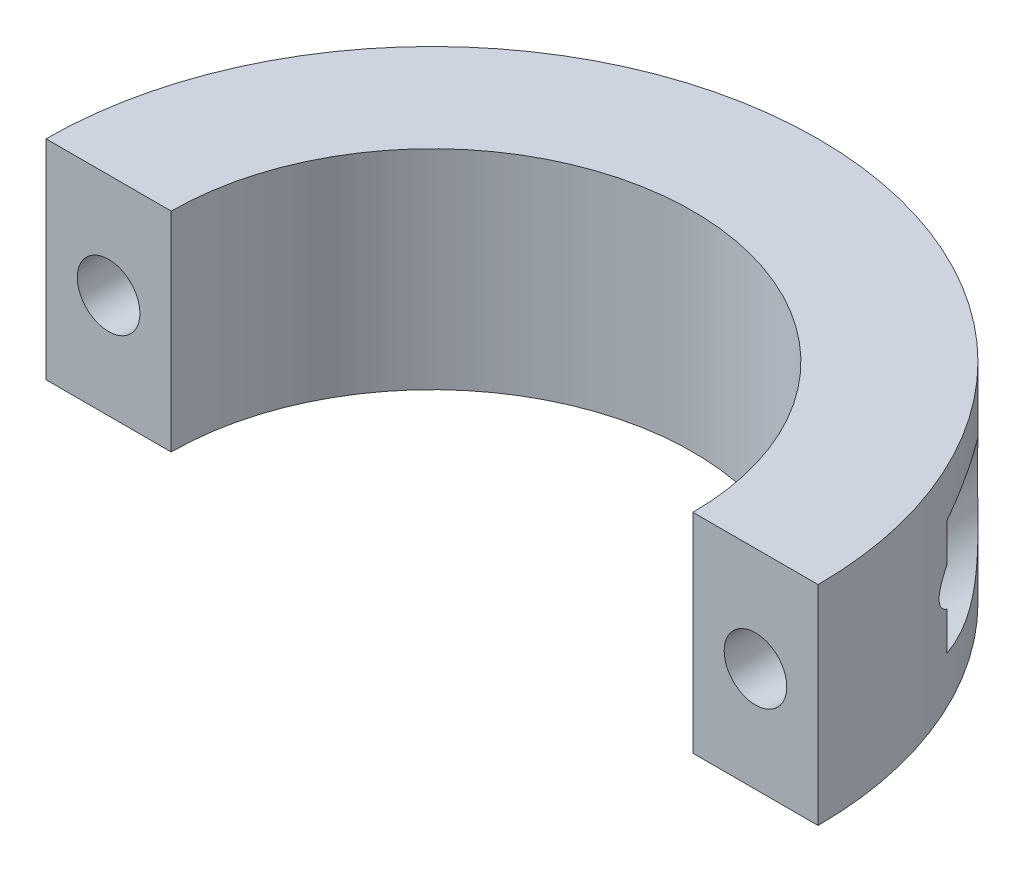
ISO-10303-21;
HEADER;
FILE_DESCRIPTION(('STEP AP214'),'2;1');
FILE_NAME('part.step','',(''),(''),'','','');
FILE_SCHEMA(('AUTOMOTIVE_DESIGN { 1 0 10303 214 1 1 1 1 }'));
ENDSEC;
DATA;
#1=APPLICATION_CONTEXT('core data for automotive mechanical design processes');
#2=APPLICATION_PROTOCOL_DEFINITION('international standard','automotive_design',2000,#1);
#3=PRODUCT_CONTEXT('',#1,'mechanical');
#4=PRODUCT('Part','Part','',(#3));
#5=PRODUCT_RELATED_PRODUCT_CATEGORY('part','',(#4));
#6=PRODUCT_DEFINITION_FORMATION('','',#4);
#7=PRODUCT_DEFINITION_CONTEXT('part definition',#1,'design');
#8=PRODUCT_DEFINITION('design','',#6,#7);
#9=PRODUCT_DEFINITION_SHAPE('','',#8);
#10=(LENGTH_UNIT() NAMED_UNIT(*) SI_UNIT(.MILLI.,.METRE.));
#11=(NAMED_UNIT(*) PLANE_ANGLE_UNIT() SI_UNIT($,.RADIAN.));
#12=(NAMED_UNIT(*) SI_UNIT($,.STERADIAN.) SOLID_ANGLE_UNIT());
#13=UNCERTAINTY_MEASURE_WITH_UNIT(LENGTH_MEASURE(1.E-05),#10,'distance_accuracy_value','');
#14=(GEOMETRIC_REPRESENTATION_CONTEXT(3) GLOBAL_UNCERTAINTY_ASSIGNED_CONTEXT((#13)) GLOBAL_UNIT_ASSIGNED_CONTEXT((#10,
#11,#12)) REPRESENTATION_CONTEXT('',''));
#15=CARTESIAN_POINT('',(0.,0.,0.));
#16=DIRECTION('',(0.,0.,1.));
#17=DIRECTION('',(1.,0.,0.));
#18=AXIS2_PLACEMENT_3D('',#15,#16,#17);
#19=CARTESIAN_POINT('',(0.,10.,0.));
#20=DIRECTION('',(0.,-1.,0.));
#21=DIRECTION('',(0.,0.,-1.));
#22=AXIS2_PLACEMENT_3D('',#19,#20,#21);
#23=CYLINDRICAL_SURFACE('',#22,18.5);
#24=CARTESIAN_POINT('',(0.,0.,0.));
#25=DIRECTION('',(0.,1.,0.));
#26=DIRECTION('',(0.,0.,1.));
#27=AXIS2_PLACEMENT_3D('',#24,#25,#26);
#28=CIRCLE('',#27,18.5);
#29=CARTESIAN_POINT('',(18.5,0.,0.));
#30=VERTEX_POINT('',#29);
#31=CARTESIAN_POINT('',(-18.5,0.,0.));
#32=VERTEX_POINT('',#31);
#33=EDGE_CURVE('E189',#30,#32,#28,.T.);
#34=ORIENTED_EDGE('',*,*,#33,.T.);
#35=DIRECTION('',(0.,-1.,0.));
#36=VECTOR('',#35,1.);
#37=CARTESIAN_POINT('',(-18.5,10.,0.));
#38=LINE('',#37,#36);
#39=CARTESIAN_POINT('',(-18.5,10.,0.));
#40=VERTEX_POINT('',#39);
#41=EDGE_CURVE('E199',#40,#32,#38,.T.);
#42=ORIENTED_EDGE('',*,*,#41,.F.);
#43=CARTESIAN_POINT('',(0.,10.,0.));
#44=DIRECTION('',(0.,1.,0.));
#45=DIRECTION('',(0.,0.,1.));
#46=AXIS2_PLACEMENT_3D('',#43,#44,#45);
#47=CIRCLE('',#46,18.5);
#48=CARTESIAN_POINT('',(18.5,10.,0.));
#49=VERTEX_POINT('',#48);
#50=EDGE_CURVE('E85',#49,#40,#47,.T.);
#51=ORIENTED_EDGE('',*,*,#50,.F.);
#52=DIRECTION('',(0.,-1.,0.));
#53=VECTOR('',#52,1.);
#54=CARTESIAN_POINT('',(18.5,10.,0.));
#55=LINE('',#54,#53);
#56=EDGE_CURVE('E197',#49,#30,#55,.T.);
#57=ORIENTED_EDGE('',*,*,#56,.T.);
#58=EDGE_LOOP('',(#34,#42,#51,#57));
#59=FACE_BOUND('',#58,.T.);
#60=CARTESIAN_POINT('',(-16.6808273176123,2.24216627658943,-8.));
#61=CARTESIAN_POINT('',(-16.6273131054231,2.21925624853974,-8.11158225504267));
#62=CARTESIAN_POINT('',(-16.5725765538614,2.19765930984917,-8.22284207285999));
#63=CARTESIAN_POINT('',(-16.4606496667734,2.15734368945134,-8.4446702027893));
#64=CARTESIAN_POINT('',(-16.403458909106,2.13862550546916,-8.55523839215838));
#65=CARTESIAN_POINT('',(-16.2279239555367,2.087091669519,-8.88633633523037));
#66=CARTESIAN_POINT('',(-16.1058883414374,2.05901551053339,-9.10569312001391));
#67=CARTESIAN_POINT('',(-15.8512215164987,2.01781455816088,-9.54217899481963));
#68=CARTESIAN_POINT('',(-15.7185084640344,2.00481996048955,-9.75927288268145));
#69=CARTESIAN_POINT('',(-15.4441553571179,1.99738540334805,-10.1878668596809));
#70=CARTESIAN_POINT('',(-15.302526443573,2.00292272157953,-10.3993734788249));
#71=CARTESIAN_POINT('',(-15.0788400785296,2.02866879916333,-10.7190129658622));
#72=CARTESIAN_POINT('',(-14.9995135421081,2.04091104050898,-10.8297298715683));
#73=CARTESIAN_POINT('',(-14.838930254364,2.07259703423088,-11.0487360665279));
#74=CARTESIAN_POINT('',(-14.7576734828093,2.09204086212282,-11.1570253303126));
#75=CARTESIAN_POINT('',(-14.5936679406102,2.13891026496183,-11.3707077257658));
#76=CARTESIAN_POINT('',(-14.5109193429459,2.16633492002991,-11.4761011896761));
#77=CARTESIAN_POINT('',(-14.3444960488358,2.23002725635092,-11.6834541291999));
#78=CARTESIAN_POINT('',(-14.2608213754837,2.26629471756322,-11.7854136901893));
#79=CARTESIAN_POINT('',(-14.0919992401886,2.34924212928554,-11.9867878718863));
#80=CARTESIAN_POINT('',(-14.0068492679345,2.39607651582347,-12.086137467272));
#81=CARTESIAN_POINT('',(-13.8374432678538,2.50083516428514,-12.2797274502856));
#82=CARTESIAN_POINT('',(-13.7531874746408,2.55876226431213,-12.3739665224361));
#83=CARTESIAN_POINT('',(-13.587313146564,2.68644389654414,-12.5558755554944));
#84=CARTESIAN_POINT('',(-13.5056862652118,2.75615543462062,-12.6435677824365));
#85=CARTESIAN_POINT('',(-13.3466676932914,2.90829012095286,-12.8113155780865));
#86=CARTESIAN_POINT('',(-13.2692719141923,2.99070069304811,-12.8913785766117));
#87=CARTESIAN_POINT('',(-13.1125556220371,3.17880934642161,-13.0508517421689));
#88=CARTESIAN_POINT('',(-13.0339976665422,3.28608412567272,-13.1291757109014));
#89=CARTESIAN_POINT('',(-12.8886632882856,3.51694414053308,-13.2718782268533));
#90=CARTESIAN_POINT('',(-12.8218832225787,3.64052431207704,-13.3362610875176));
#91=CARTESIAN_POINT('',(-12.7335420205535,3.83725684035735,-13.4204544446403));
#92=CARTESIAN_POINT('',(-12.7059561751229,3.90510493546882,-13.4465566346186));
#93=CARTESIAN_POINT('',(-12.6554212201761,4.04405739871183,-13.4941288915382));
#94=CARTESIAN_POINT('',(-12.6324697033015,4.11516005255315,-13.5156013638379));
#95=CARTESIAN_POINT('',(-12.5917050923089,4.2600805151752,-13.5535878718061));
#96=CARTESIAN_POINT('',(-12.5738894143916,4.33389693753054,-13.5701044009415));
#97=CARTESIAN_POINT('',(-12.5437943681128,4.48358206329639,-13.5979275743063));
#98=CARTESIAN_POINT('',(-12.531514081712,4.5594504241809,-13.6092350824536));
#99=CARTESIAN_POINT('',(-12.5059464407527,4.76878607802364,-13.6327492693608));
#100=CARTESIAN_POINT('',(-12.4985288639878,4.9036789168311,-13.6395305120175));
#101=CARTESIAN_POINT('',(-12.5019602332136,5.17292990100803,-13.6363845946899));
#102=CARTESIAN_POINT('',(-12.5128028405035,5.30728821570064,-13.6264632327205));
#103=CARTESIAN_POINT('',(-12.5504412770419,5.56163074968477,-13.5917990630945));
#104=CARTESIAN_POINT('',(-12.5760282952034,5.68195225596617,-13.5681785162082));
#105=CARTESIAN_POINT('',(-12.640547050979,5.91554556130104,-13.5080902047127));
#106=CARTESIAN_POINT('',(-12.6794796397169,6.02881691018086,-13.4716216207061));
#107=CARTESIAN_POINT('',(-12.771423973953,6.25319672639045,-13.3845046301893));
#108=CARTESIAN_POINT('',(-12.8251769482911,6.36370348605095,-13.3330984765542));
#109=CARTESIAN_POINT('',(-12.9426316084479,6.57299069897161,-13.2191150320653));
#110=CARTESIAN_POINT('',(-13.0063391851983,6.67176414737953,-13.1565311232859));
#111=CARTESIAN_POINT('',(-13.1742283823113,6.90262093633876,-12.9888312935535));
#112=CARTESIAN_POINT('',(-13.2829189444111,7.0272322524094,-12.8779243398225));
#113=CARTESIAN_POINT('',(-13.5094505600996,7.25013213026865,-12.6400876642241));
#114=CARTESIAN_POINT('',(-13.6273108481733,7.34836332613991,-12.5131238926482));
#115=CARTESIAN_POINT('',(-13.8337232847752,7.49698323766707,-12.2839317094177));
#116=CARTESIAN_POINT('',(-13.921402491358,7.55309648277254,-12.1845274570241));
#117=CARTESIAN_POINT('',(-14.0973628097534,7.65384500669754,-11.980504944953));
#118=CARTESIAN_POINT('',(-14.1856441766033,7.69847506638472,-11.8758843401295));
#119=CARTESIAN_POINT('',(-14.361779264616,7.77736900018666,-11.6622679859082));
#120=CARTESIAN_POINT('',(-14.4496323077324,7.81161975725163,-11.5532668958877));
#121=CARTESIAN_POINT('',(-14.6240296059947,7.87074080650371,-11.3317103368167));
#122=CARTESIAN_POINT('',(-14.7105734089107,7.89560792539827,-11.2191536792896));
#123=CARTESIAN_POINT('',(-14.9331542760877,7.94933320522793,-10.922587063492));
#124=CARTESIAN_POINT('',(-15.06770449372,7.97162097693509,-10.7362571616158));
#125=CARTESIAN_POINT('',(-15.330332206666,7.99810600139789,-10.3578027816951));
#126=CARTESIAN_POINT('',(-15.4584052481586,8.0022909691027,-10.1656744576956));
#127=CARTESIAN_POINT('',(-15.7072531152755,7.99542170445775,-9.7767862440493));
#128=CARTESIAN_POINT('',(-15.8280201296745,7.98435145243438,-9.58002169922591));
#129=CARTESIAN_POINT('',(-16.0615715861235,7.94933429785667,-9.18307879613023));
#130=CARTESIAN_POINT('',(-16.1743592191563,7.92539257596452,-8.98290184269074));
#131=CARTESIAN_POINT('',(-16.3528573226083,7.8771271717181,-8.65191844135857));
#132=CARTESIAN_POINT('',(-16.4209720824553,7.85600558566275,-8.52191969968121));
#133=CARTESIAN_POINT('',(-16.5535543157906,7.80979053259217,-8.26142350461591));
#134=CARTESIAN_POINT('',(-16.6180349483723,7.7847128382875,-8.13092995927584));
#135=CARTESIAN_POINT('',(-16.6808273176123,7.75783372341057,-8.));
#136=B_SPLINE_CURVE_WITH_KNOTS('',3,(#60,#61,#62,#63,#64,#65,#66,#67,#68,#69,#70,#71,#72,#73,
#74,#75,#76,#77,#78,#79,#80,#81,#82,#83,#84,#85,#86,#87,#88,#89,#90,#91,#92,#93,#94,#95,#96,#97,
#98,#99,#100,#101,#102,#103,#104,#105,#106,#107,#108,#109,#110,#111,#112,#113,#114,#115,#116,
#117,#118,#119,#120,#121,#122,#123,#124,#125,#126,#127,#128,#129,#130,#131,#132,#133,#134,#135),
.UNSPECIFIED.,.F.,.F.,(4,2,2,2,2,2,2,2,2,2,2,2,2,2,2,2,2,2,2,2,2,2,2,2,2,2,2,2,2,2,2,2,2,2,2,2,
2,4),(0.,0.37753515629701,0.755135513694899,1.512250142556,2.27585326643714,3.03852046667838,
3.44858858644865,3.85866100630569,4.2686861794682,4.6787011507798,5.09514891450285,
5.51170337030995,5.92676964048657,6.34142747132127,6.80272225432187,7.26387410594381,
7.49684688697526,7.72969833433968,7.96243243075055,8.19512791422785,8.59852461887044,
9.00178132032628,9.37591212277148,9.75006679013187,10.1481521673188,10.5464740218395,
11.1404643139997,11.7357360193284,12.166981823343,12.598423284645,13.0304077364018,
13.4625381429724,14.1541615340059,14.8462542057573,15.5390742057056,16.2316155597639,
16.6763501377223,17.1193544315548),.UNSPECIFIED.);
#137=CARTESIAN_POINT('',(-16.6808273176123,2.24216627658943,-8.));
#138=VERTEX_POINT('',#137);
#139=CARTESIAN_POINT('',(-16.6808273176123,7.75783372341057,-8.));
#140=VERTEX_POINT('',#139);
#141=EDGE_CURVE('E193',#138,#140,#136,.T.);
#142=ORIENTED_EDGE('',*,*,#141,.T.);
#143=DIRECTION('',(0.,-1.,0.));
#144=VECTOR('',#143,1.);
#145=CARTESIAN_POINT('',(-16.6808273176123,10.,-8.));
#146=LINE('',#145,#144);
#147=CARTESIAN_POINT('',(-16.6808273176123,5.92501180856279,-8.));
#148=VERTEX_POINT('',#147);
#149=EDGE_CURVE('E139',#140,#148,#146,.T.);
#150=ORIENTED_EDGE('',*,*,#149,.T.);
#151=CARTESIAN_POINT('',(-16.6808273176123,5.92501180856279,-8.));
#152=CARTESIAN_POINT('',(-16.7008671363795,5.89939894681842,-7.95822019085314));
#153=CARTESIAN_POINT('',(-16.720494112819,5.8726578692459,-7.91688807306192));
#154=CARTESIAN_POINT('',(-16.7588404323034,5.81639523655956,-7.83538662779554));
#155=CARTESIAN_POINT('',(-16.7775548760291,5.78686074343342,-7.79522396283188));
#156=CARTESIAN_POINT('',(-16.8141351185909,5.72414664206879,-7.71600951827897));
#157=CARTESIAN_POINT('',(-16.831978397616,5.69090902464334,-7.67699273545517));
#158=CARTESIAN_POINT('',(-16.8660813234932,5.62075927847746,-7.60177590157281));
#159=CARTESIAN_POINT('',(-16.882344301469,5.58385522586027,-7.56556995943572));
#160=CARTESIAN_POINT('',(-16.9100280567259,5.51282909137866,-7.50345842040993));
#161=CARTESIAN_POINT('',(-16.9217901256394,5.47943571930165,-7.47688089320201));
#162=CARTESIAN_POINT('',(-16.9435008198704,5.4094443655528,-7.42755029971113));
#163=CARTESIAN_POINT('',(-16.9534532318428,5.37285331828388,-7.40478925550685));
#164=CARTESIAN_POINT('',(-16.9711081304078,5.2956832276547,-7.3642369997729));
#165=CARTESIAN_POINT('',(-16.9787744476922,5.25505239215455,-7.34652585873552));
#166=CARTESIAN_POINT('',(-16.9908402820327,5.17084481659007,-7.31857813240109));
#167=CARTESIAN_POINT('',(-16.9952485234202,5.12727628728029,-7.30832158675243));
#168=CARTESIAN_POINT('',(-16.9998983298595,5.04336106571754,-7.29749884422195));
#169=CARTESIAN_POINT('',(-17.0005283312507,5.00315557636883,-7.29602931768692));
#170=CARTESIAN_POINT('',(-16.9985686762657,4.92324318881803,-7.30059367093314));
#171=CARTESIAN_POINT('',(-16.995976872241,4.88353664103863,-7.30663255580595));
#172=CARTESIAN_POINT('',(-16.9877423567979,4.80433656132057,-7.32575710132319));
#173=CARTESIAN_POINT('',(-16.9819673785268,4.76493332272838,-7.33914815611633));
#174=CARTESIAN_POINT('',(-16.9679203078601,4.68902395488642,-7.37156651364212));
#175=CARTESIAN_POINT('',(-16.9596445908914,4.65252212859586,-7.39060199665994));
#176=CARTESIAN_POINT('',(-16.9356872466417,4.56164848294266,-7.44538984156874));
#177=CARTESIAN_POINT('',(-16.9185341610922,4.50962128611862,-7.48433696082816));
#178=CARTESIAN_POINT('',(-16.881001371215,4.41213898500713,-7.56861617360726));
#179=CARTESIAN_POINT('',(-16.8606043425169,4.36672182890503,-7.6139823962218));
#180=CARTESIAN_POINT('',(-16.8148684550805,4.27611942033153,-7.71450652624005));
#181=CARTESIAN_POINT('',(-16.789230484014,4.23166586063975,-7.77018046097729));
#182=CARTESIAN_POINT('',(-16.7493930713285,4.16957546840608,-7.85549518850586));
#183=CARTESIAN_POINT('',(-16.7359974775835,4.14978557186666,-7.88399675735109));
#184=CARTESIAN_POINT('',(-16.7087479345267,4.1114735393401,-7.94158393738102));
#185=CARTESIAN_POINT('',(-16.6948944159331,4.09295025964579,-7.97066899016277));
#186=CARTESIAN_POINT('',(-16.6808273176123,4.07498819143721,-8.));
#187=B_SPLINE_CURVE_WITH_KNOTS('',3,(#151,#152,#153,#154,#155,#156,#157,#158,#159,#160,#161,
#162,#163,#164,#165,#166,#167,#168,#169,#170,#171,#172,#173,#174,#175,#176,#177,#178,#179,#180,
#181,#182,#183,#184,#185,#186),.UNSPECIFIED.,.F.,.F.,(4,2,2,2,2,2,2,2,2,2,2,2,2,2,2,2,2,4),(0.,
0.158873795982409,0.318523281045564,0.481169120019656,0.643464321096317,0.776030303303831,
0.908315620122257,1.04259461627888,1.17651273027173,1.29638860370451,1.41634442900648,
1.54170782154132,1.66725379460788,1.8677674526792,2.06939032930093,2.296095041544,
2.40765884931722,2.51912055130842),.UNSPECIFIED.);
#188=CARTESIAN_POINT('',(-16.6808273176123,4.07498819143721,-8.));
#189=VERTEX_POINT('',#188);
#190=EDGE_CURVE('E142',#148,#189,#187,.T.);
#191=ORIENTED_EDGE('',*,*,#190,.T.);
#192=EDGE_CURVE('E136',#189,#138,#146,.T.);
#193=ORIENTED_EDGE('',*,*,#192,.T.);
#194=EDGE_LOOP('',(#142,#150,#191,#193));
#195=FACE_BOUND('',#194,.T.);
#196=CARTESIAN_POINT('',(16.6808273176123,2.24216627658943,-8.));
#197=CARTESIAN_POINT('',(16.6273131054231,2.21925624853974,-8.11158225504267));
#198=CARTESIAN_POINT('',(16.5725765538614,2.19765930984917,-8.22284207285999));
#199=CARTESIAN_POINT('',(16.4606496667734,2.15734368945134,-8.4446702027893));
#200=CARTESIAN_POINT('',(16.403458909106,2.13862550546916,-8.55523839215838));
#201=CARTESIAN_POINT('',(16.2279239555367,2.087091669519,-8.88633633523037));
#202=CARTESIAN_POINT('',(16.1058883414374,2.05901551053339,-9.10569312001391));
#203=CARTESIAN_POINT('',(15.8512215164987,2.01781455816088,-9.54217899481963));
#204=CARTESIAN_POINT('',(15.7185084640344,2.00481996048955,-9.75927288268145));
#205=CARTESIAN_POINT('',(15.4441553571179,1.99738540334805,-10.1878668596809));
#206=CARTESIAN_POINT('',(15.302526443573,2.00292272157953,-10.3993734788249));
#207=CARTESIAN_POINT('',(15.0788400785296,2.02866879916333,-10.7190129658622));
#208=CARTESIAN_POINT('',(14.9995135421081,2.04091104050898,-10.8297298715683));
#209=CARTESIAN_POINT('',(14.838930254364,2.07259703423088,-11.0487360665279));
#210=CARTESIAN_POINT('',(14.7576734828093,2.09204086212282,-11.1570253303126));
#211=CARTESIAN_POINT('',(14.5936679406102,2.13891026496183,-11.3707077257658));
#212=CARTESIAN_POINT('',(14.5109193429459,2.16633492002991,-11.4761011896761));
#213=CARTESIAN_POINT('',(14.3444960488358,2.23002725635092,-11.6834541291999));
#214=CARTESIAN_POINT('',(14.2608213754837,2.26629471756322,-11.7854136901893));
#215=CARTESIAN_POINT('',(14.0919992401886,2.34924212928554,-11.9867878718863));
#216=CARTESIAN_POINT('',(14.0068492679345,2.39607651582347,-12.086137467272));
#217=CARTESIAN_POINT('',(13.8374432678538,2.50083516428514,-12.2797274502856));
#218=CARTESIAN_POINT('',(13.7531874746408,2.55876226431213,-12.3739665224361));
#219=CARTESIAN_POINT('',(13.587313146564,2.68644389654414,-12.5558755554944));
#220=CARTESIAN_POINT('',(13.5056862652118,2.75615543462062,-12.6435677824365));
#221=CARTESIAN_POINT('',(13.3466676932914,2.90829012095286,-12.8113155780865));
#222=CARTESIAN_POINT('',(13.2692719141923,2.99070069304811,-12.8913785766117));
#223=CARTESIAN_POINT('',(13.1125556220371,3.17880934642161,-13.0508517421689));
#224=CARTESIAN_POINT('',(13.0339976665422,3.28608412567272,-13.1291757109014));
#225=CARTESIAN_POINT('',(12.8886632882856,3.51694414053308,-13.2718782268533));
#226=CARTESIAN_POINT('',(12.8218832225787,3.64052431207704,-13.3362610875176));
#227=CARTESIAN_POINT('',(12.7335420205535,3.83725684035735,-13.4204544446403));
#228=CARTESIAN_POINT('',(12.7059561751229,3.90510493546882,-13.4465566346186));
#229=CARTESIAN_POINT('',(12.6554212201761,4.04405739871183,-13.4941288915382));
#230=CARTESIAN_POINT('',(12.6324697033015,4.11516005255315,-13.5156013638379));
#231=CARTESIAN_POINT('',(12.5917050923089,4.2600805151752,-13.5535878718061));
#232=CARTESIAN_POINT('',(12.5738894143916,4.33389693753054,-13.5701044009415));
#233=CARTESIAN_POINT('',(12.5437943681128,4.48358206329639,-13.5979275743063));
#234=CARTESIAN_POINT('',(12.531514081712,4.5594504241809,-13.6092350824536));
#235=CARTESIAN_POINT('',(12.5059464407527,4.76878607802364,-13.6327492693608));
#236=CARTESIAN_POINT('',(12.4985288639878,4.9036789168311,-13.6395305120175));
#237=CARTESIAN_POINT('',(12.5019602332136,5.17292990100803,-13.6363845946899));
#238=CARTESIAN_POINT('',(12.5128028405035,5.30728821570064,-13.6264632327205));
#239=CARTESIAN_POINT('',(12.5504412770419,5.56163074968477,-13.5917990630945));
#240=CARTESIAN_POINT('',(12.5760282952034,5.68195225596617,-13.5681785162082));
#241=CARTESIAN_POINT('',(12.640547050979,5.91554556130104,-13.5080902047127));
#242=CARTESIAN_POINT('',(12.6794796397169,6.02881691018086,-13.4716216207061));
#243=CARTESIAN_POINT('',(12.771423973953,6.25319672639045,-13.3845046301893));
#244=CARTESIAN_POINT('',(12.8251769482911,6.36370348605095,-13.3330984765542));
#245=CARTESIAN_POINT('',(12.9426316084479,6.57299069897161,-13.2191150320653));
#246=CARTESIAN_POINT('',(13.0063391851983,6.67176414737953,-13.1565311232859));
#247=CARTESIAN_POINT('',(13.1742283823113,6.90262093633876,-12.9888312935535));
#248=CARTESIAN_POINT('',(13.2829189444111,7.0272322524094,-12.8779243398225));
#249=CARTESIAN_POINT('',(13.5094505600996,7.25013213026865,-12.6400876642241));
#250=CARTESIAN_POINT('',(13.6273108481733,7.34836332613991,-12.5131238926482));
#251=CARTESIAN_POINT('',(13.8337232847752,7.49698323766707,-12.2839317094177));
#252=CARTESIAN_POINT('',(13.921402491358,7.55309648277254,-12.1845274570241));
#253=CARTESIAN_POINT('',(14.0973628097534,7.65384500669754,-11.980504944953));
#254=CARTESIAN_POINT('',(14.1856441766033,7.69847506638472,-11.8758843401295));
#255=CARTESIAN_POINT('',(14.361779264616,7.77736900018666,-11.6622679859082));
#256=CARTESIAN_POINT('',(14.4496323077324,7.81161975725163,-11.5532668958877));
#257=CARTESIAN_POINT('',(14.6240296059947,7.87074080650371,-11.3317103368167));
#258=CARTESIAN_POINT('',(14.7105734089107,7.89560792539827,-11.2191536792896));
#259=CARTESIAN_POINT('',(14.9331542760877,7.94933320522793,-10.922587063492));
#260=CARTESIAN_POINT('',(15.06770449372,7.97162097693509,-10.7362571616158));
#261=CARTESIAN_POINT('',(15.330332206666,7.99810600139789,-10.3578027816951));
#262=CARTESIAN_POINT('',(15.4584052481586,8.0022909691027,-10.1656744576956));
#263=CARTESIAN_POINT('',(15.7072531152755,7.99542170445775,-9.7767862440493));
#264=CARTESIAN_POINT('',(15.8280201296745,7.98435145243438,-9.58002169922591));
#265=CARTESIAN_POINT('',(16.0615715861235,7.94933429785667,-9.18307879613023));
#266=CARTESIAN_POINT('',(16.1743592191563,7.92539257596452,-8.98290184269074));
#267=CARTESIAN_POINT('',(16.3528573226083,7.8771271717181,-8.65191844135857));
#268=CARTESIAN_POINT('',(16.4209720824553,7.85600558566275,-8.52191969968121));
#269=CARTESIAN_POINT('',(16.5535543157906,7.80979053259217,-8.26142350461591));
#270=CARTESIAN_POINT('',(16.6180349483723,7.7847128382875,-8.13092995927584));
#271=CARTESIAN_POINT('',(16.6808273176123,7.75783372341057,-8.));
#272=B_SPLINE_CURVE_WITH_KNOTS('',3,(#196,#197,#198,#199,#200,#201,#202,#203,#204,#205,#206,
#207,#208,#209,#210,#211,#212,#213,#214,#215,#216,#217,#218,#219,#220,#221,#222,#223,#224,#225,
#226,#227,#228,#229,#230,#231,#232,#233,#234,#235,#236,#237,#238,#239,#240,#241,#242,#243,#244,
#245,#246,#247,#248,#249,#250,#251,#252,#253,#254,#255,#256,#257,#258,#259,#260,#261,#262,#263,
#264,#265,#266,#267,#268,#269,#270,#271),.UNSPECIFIED.,.F.,.F.,(4,2,2,2,2,2,2,2,2,2,2,2,2,2,2,2,
2,2,2,2,2,2,2,2,2,2,2,2,2,2,2,2,2,2,2,2,2,4),(0.,0.37753515629701,0.755135513694899,
1.512250142556,2.27585326643714,3.03852046667838,3.44858858644865,3.85866100630569,
4.2686861794682,4.6787011507798,5.09514891450285,5.51170337030995,5.92676964048657,
6.34142747132127,6.80272225432187,7.26387410594381,7.49684688697526,7.72969833433968,
7.96243243075055,8.19512791422785,8.59852461887044,9.00178132032628,9.37591212277148,
9.75006679013187,10.1481521673188,10.5464740218395,11.1404643139997,11.7357360193284,
12.166981823343,12.598423284645,13.0304077364018,13.4625381429724,14.1541615340059,
14.8462542057573,15.5390742057056,16.2316155597639,16.6763501377223,17.1193544315548),.UNSPECIFIED.);
#273=CARTESIAN_POINT('',(16.6808273176123,2.24216627658943,-8.));
#274=VERTEX_POINT('',#273);
#275=CARTESIAN_POINT('',(16.6808273176123,7.75783372341057,-8.));
#276=VERTEX_POINT('',#275);
#277=EDGE_CURVE('E11',#274,#276,#272,.T.);
#278=ORIENTED_EDGE('',*,*,#277,.F.);
#279=DIRECTION('',(0.,-1.,0.));
#280=VECTOR('',#279,1.);
#281=CARTESIAN_POINT('',(16.6808273176123,10.,-8.));
#282=LINE('',#281,#280);
#283=CARTESIAN_POINT('',(16.6808273176123,4.07498819143721,-8.));
#284=VERTEX_POINT('',#283);
#285=EDGE_CURVE('E122',#274,#284,#282,.F.);
#286=ORIENTED_EDGE('',*,*,#285,.T.);
#287=CARTESIAN_POINT('',(16.6808273176123,5.92501180856279,-8.));
#288=CARTESIAN_POINT('',(16.7008671363795,5.89939894681842,-7.95822019085314));
#289=CARTESIAN_POINT('',(16.720494112819,5.8726578692459,-7.91688807306192));
#290=CARTESIAN_POINT('',(16.7588404323034,5.81639523655956,-7.83538662779554));
#291=CARTESIAN_POINT('',(16.7775548760291,5.78686074343342,-7.79522396283188));
#292=CARTESIAN_POINT('',(16.8141351185909,5.72414664206879,-7.71600951827897));
#293=CARTESIAN_POINT('',(16.831978397616,5.69090902464334,-7.67699273545517));
#294=CARTESIAN_POINT('',(16.8660813234932,5.62075927847746,-7.60177590157281));
#295=CARTESIAN_POINT('',(16.882344301469,5.58385522586027,-7.56556995943572));
#296=CARTESIAN_POINT('',(16.9100280567259,5.51282909137866,-7.50345842040993));
#297=CARTESIAN_POINT('',(16.9217901256394,5.47943571930165,-7.47688089320201));
#298=CARTESIAN_POINT('',(16.9435008198704,5.4094443655528,-7.42755029971113));
#299=CARTESIAN_POINT('',(16.9534532318428,5.37285331828388,-7.40478925550685));
#300=CARTESIAN_POINT('',(16.9711081304078,5.2956832276547,-7.3642369997729));
#301=CARTESIAN_POINT('',(16.9787744476922,5.25505239215455,-7.34652585873552));
#302=CARTESIAN_POINT('',(16.9908402820327,5.17084481659007,-7.31857813240109));
#303=CARTESIAN_POINT('',(16.9952485234202,5.12727628728029,-7.30832158675243));
#304=CARTESIAN_POINT('',(16.9998983298595,5.04336106571754,-7.29749884422195));
#305=CARTESIAN_POINT('',(17.0005283312507,5.00315557636883,-7.29602931768692));
#306=CARTESIAN_POINT('',(16.9985686762657,4.92324318881803,-7.30059367093314));
#307=CARTESIAN_POINT('',(16.995976872241,4.88353664103863,-7.30663255580595));
#308=CARTESIAN_POINT('',(16.9877423567979,4.80433656132057,-7.32575710132319));
#309=CARTESIAN_POINT('',(16.9819673785268,4.76493332272838,-7.33914815611633));
#310=CARTESIAN_POINT('',(16.9679203078601,4.68902395488642,-7.37156651364212));
#311=CARTESIAN_POINT('',(16.9596445908914,4.65252212859586,-7.39060199665994));
#312=CARTESIAN_POINT('',(16.9356872466417,4.56164848294266,-7.44538984156874));
#313=CARTESIAN_POINT('',(16.9185341610922,4.50962128611862,-7.48433696082816));
#314=CARTESIAN_POINT('',(16.881001371215,4.41213898500713,-7.56861617360726));
#315=CARTESIAN_POINT('',(16.8606043425169,4.36672182890503,-7.6139823962218));
#316=CARTESIAN_POINT('',(16.8148684550805,4.27611942033153,-7.71450652624005));
#317=CARTESIAN_POINT('',(16.789230484014,4.23166586063975,-7.77018046097729));
#318=CARTESIAN_POINT('',(16.7493930713285,4.16957546840608,-7.85549518850586));
#319=CARTESIAN_POINT('',(16.7359974775835,4.14978557186666,-7.88399675735109));
#320=CARTESIAN_POINT('',(16.7087479345267,4.1114735393401,-7.94158393738102));
#321=CARTESIAN_POINT('',(16.6948944159331,4.09295025964579,-7.97066899016277));
#322=CARTESIAN_POINT('',(16.6808273176123,4.07498819143721,-8.));
#323=B_SPLINE_CURVE_WITH_KNOTS('',3,(#287,#288,#289,#290,#291,#292,#293,#294,#295,#296,#297,
#298,#299,#300,#301,#302,#303,#304,#305,#306,#307,#308,#309,#310,#311,#312,#313,#314,#315,#316,
#317,#318,#319,#320,#321,#322),.UNSPECIFIED.,.F.,.F.,(4,2,2,2,2,2,2,2,2,2,2,2,2,2,2,2,2,4),(0.,
0.158873795982409,0.318523281045564,0.481169120019656,0.643464321096317,0.776030303303831,
0.908315620122257,1.04259461627888,1.17651273027173,1.29638860370451,1.41634442900648,
1.54170782154132,1.66725379460788,1.8677674526792,2.06939032930093,2.296095041544,
2.40765884931722,2.51912055130842),.UNSPECIFIED.);
#324=CARTESIAN_POINT('',(16.6808273176123,5.92501180856279,-8.));
#325=VERTEX_POINT('',#324);
#326=EDGE_CURVE('E49',#325,#284,#323,.T.);
#327=ORIENTED_EDGE('',*,*,#326,.F.);
#328=EDGE_CURVE('E120',#325,#276,#282,.F.);
#329=ORIENTED_EDGE('',*,*,#328,.T.);
#330=EDGE_LOOP('',(#278,#286,#327,#329));
#331=FACE_BOUND('',#330,.T.);
#332=ADVANCED_FACE('F35',(#59,#195,#331),#23,.T.);
#333=CARTESIAN_POINT('',(0.,10.,0.));
#334=DIRECTION('',(0.,0.,-1.));
#335=DIRECTION('',(-1.,0.,0.));
#336=AXIS2_PLACEMENT_3D('',#333,#334,#335);
#337=PLANE('',#336);
#338=CARTESIAN_POINT('',(15.5,5.,0.));
#339=DIRECTION('',(0.,0.,-1.));
#340=DIRECTION('',(-1.,0.,0.));
#341=AXIS2_PLACEMENT_3D('',#338,#339,#340);
#342=CIRCLE('',#341,1.5);
#343=CARTESIAN_POINT('',(14.,5.,0.));
#344=VERTEX_POINT('',#343);
#345=EDGE_CURVE('E127',#344,#344,#342,.T.);
#346=ORIENTED_EDGE('',*,*,#345,.T.);
#347=EDGE_LOOP('',(#346));
#348=FACE_BOUND('',#347,.T.);
#349=DIRECTION('',(1.,0.,0.));
#350=VECTOR('',#349,1.);
#351=CARTESIAN_POINT('',(0.,0.,0.));
#352=LINE('',#351,#350);
#353=CARTESIAN_POINT('',(12.5,0.,0.));
#354=VERTEX_POINT('',#353);
#355=EDGE_CURVE('E153',#354,#30,#352,.T.);
#356=ORIENTED_EDGE('',*,*,#355,.T.);
#357=ORIENTED_EDGE('',*,*,#56,.F.);
#358=DIRECTION('',(1.,0.,0.));
#359=VECTOR('',#358,1.);
#360=CARTESIAN_POINT('',(0.,10.,0.));
#361=LINE('',#360,#359);
#362=CARTESIAN_POINT('',(12.5,10.,0.));
#363=VERTEX_POINT('',#362);
#364=EDGE_CURVE('E154',#363,#49,#361,.T.);
#365=ORIENTED_EDGE('',*,*,#364,.F.);
#366=DIRECTION('',(0.,-1.,0.));
#367=VECTOR('',#366,1.);
#368=CARTESIAN_POINT('',(12.5,10.,0.));
#369=LINE('',#368,#367);
#370=EDGE_CURVE('E57',#363,#354,#369,.T.);
#371=ORIENTED_EDGE('',*,*,#370,.T.);
#372=EDGE_LOOP('',(#356,#357,#365,#371));
#373=FACE_BOUND('',#372,.T.);
#374=ADVANCED_FACE('F177',(#348,#373),#337,.F.);
#375=CARTESIAN_POINT('',(-15.5,5.,0.));
#376=DIRECTION('',(0.,0.,1.));
#377=DIRECTION('',(1.,0.,0.));
#378=AXIS2_PLACEMENT_3D('',#375,#376,#377);
#379=CIRCLE('',#378,1.5);
#380=CARTESIAN_POINT('',(-14.,5.,0.));
#381=VERTEX_POINT('',#380);
#382=EDGE_CURVE('E143',#381,#381,#379,.T.);
#383=ORIENTED_EDGE('',*,*,#382,.F.);
#384=EDGE_LOOP('',(#383));
#385=FACE_BOUND('',#384,.T.);
#386=CARTESIAN_POINT('',(-12.5,0.,0.));
#387=VERTEX_POINT('',#386);
#388=EDGE_CURVE('E298',#32,#387,#352,.T.);
#389=ORIENTED_EDGE('',*,*,#388,.T.);
#390=DIRECTION('',(0.,-1.,0.));
#391=VECTOR('',#390,1.);
#392=CARTESIAN_POINT('',(-12.5,10.,0.));
#393=LINE('',#392,#391);
#394=CARTESIAN_POINT('',(-12.5,10.,0.));
#395=VERTEX_POINT('',#394);
#396=EDGE_CURVE('E73',#395,#387,#393,.T.);
#397=ORIENTED_EDGE('',*,*,#396,.F.);
#398=EDGE_CURVE('E304',#40,#395,#361,.T.);
#399=ORIENTED_EDGE('',*,*,#398,.F.);
#400=ORIENTED_EDGE('',*,*,#41,.T.);
#401=EDGE_LOOP('',(#389,#397,#399,#400));
#402=FACE_BOUND('',#401,.T.);
#403=ADVANCED_FACE('F175',(#385,#402),#337,.F.);
#404=CARTESIAN_POINT('',(0.,10.,0.));
#405=DIRECTION('',(0.,-1.,0.));
#406=DIRECTION('',(0.,0.,-1.));
#407=AXIS2_PLACEMENT_3D('',#404,#405,#406);
#408=CYLINDRICAL_SURFACE('',#407,12.5);
#409=CARTESIAN_POINT('',(0.,0.,0.));
#410=DIRECTION('',(0.,1.,0.));
#411=DIRECTION('',(0.,0.,1.));
#412=AXIS2_PLACEMENT_3D('',#409,#410,#411);
#413=CIRCLE('',#412,12.5);
#414=EDGE_CURVE('E301',#354,#387,#413,.T.);
#415=ORIENTED_EDGE('',*,*,#414,.F.);
#416=ORIENTED_EDGE('',*,*,#370,.F.);
#417=CARTESIAN_POINT('',(0.,10.,0.));
#418=DIRECTION('',(0.,1.,0.));
#419=DIRECTION('',(0.,0.,1.));
#420=AXIS2_PLACEMENT_3D('',#417,#418,#419);
#421=CIRCLE('',#420,12.5);
#422=EDGE_CURVE('E307',#363,#395,#421,.T.);
#423=ORIENTED_EDGE('',*,*,#422,.T.);
#424=ORIENTED_EDGE('',*,*,#396,.T.);
#425=EDGE_LOOP('',(#415,#416,#423,#424));
#426=FACE_BOUND('',#425,.T.);
#427=ADVANCED_FACE('F169',(#426),#408,.F.);
#428=CARTESIAN_POINT('',(0.,10.,0.));
#429=DIRECTION('',(0.,1.,0.));
#430=DIRECTION('',(0.,0.,1.));
#431=AXIS2_PLACEMENT_3D('',#428,#429,#430);
#432=PLANE('',#431);
#433=ORIENTED_EDGE('',*,*,#364,.T.);
#434=ORIENTED_EDGE('',*,*,#50,.T.);
#435=ORIENTED_EDGE('',*,*,#398,.T.);
#436=ORIENTED_EDGE('',*,*,#422,.F.);
#437=EDGE_LOOP('',(#433,#434,#435,#436));
#438=FACE_BOUND('',#437,.T.);
#439=ADVANCED_FACE('F166',(#438),#432,.T.);
#440=CARTESIAN_POINT('',(0.,0.,0.));
#441=DIRECTION('',(0.,1.,0.));
#442=DIRECTION('',(0.,0.,1.));
#443=AXIS2_PLACEMENT_3D('',#440,#441,#442);
#444=PLANE('',#443);
#445=ORIENTED_EDGE('',*,*,#355,.F.);
#446=ORIENTED_EDGE('',*,*,#414,.T.);
#447=ORIENTED_EDGE('',*,*,#388,.F.);
#448=ORIENTED_EDGE('',*,*,#33,.F.);
#449=EDGE_LOOP('',(#445,#446,#447,#448));
#450=FACE_BOUND('',#449,.T.);
#451=ADVANCED_FACE('F162',(#450),#444,.F.);
#452=CARTESIAN_POINT('',(-15.5,5.,-8.));
#453=DIRECTION('',(0.,0.,1.));
#454=DIRECTION('',(1.,0.,0.));
#455=AXIS2_PLACEMENT_3D('',#452,#453,#454);
#456=CYLINDRICAL_SURFACE('',#455,1.5);
#457=ORIENTED_EDGE('',*,*,#382,.T.);
#458=EDGE_LOOP('',(#457));
#459=FACE_BOUND('',#458,.T.);
#460=CARTESIAN_POINT('',(-15.5,5.,-8.));
#461=DIRECTION('',(0.,0.,1.));
#462=DIRECTION('',(1.,0.,0.));
#463=AXIS2_PLACEMENT_3D('',#460,#461,#462);
#464=CIRCLE('',#463,1.5);
#465=EDGE_CURVE('E140',#189,#148,#464,.T.);
#466=ORIENTED_EDGE('',*,*,#465,.F.);
#467=ORIENTED_EDGE('',*,*,#190,.F.);
#468=EDGE_LOOP('',(#466,#467));
#469=FACE_BOUND('',#468,.T.);
#470=ADVANCED_FACE('F156',(#459,#469),#456,.F.);
#471=CARTESIAN_POINT('',(-15.5,5.,-18.5));
#472=DIRECTION('',(0.,0.,1.));
#473=DIRECTION('',(1.,0.,0.));
#474=AXIS2_PLACEMENT_3D('',#471,#472,#473);
#475=CYLINDRICAL_SURFACE('',#474,3.);
#476=CARTESIAN_POINT('',(-15.5,5.,-8.));
#477=DIRECTION('',(0.,0.,1.));
#478=DIRECTION('',(1.,0.,0.));
#479=AXIS2_PLACEMENT_3D('',#476,#477,#478);
#480=CIRCLE('',#479,3.);
#481=EDGE_CURVE('E131',#138,#140,#480,.T.);
#482=ORIENTED_EDGE('',*,*,#481,.T.);
#483=ORIENTED_EDGE('',*,*,#141,.F.);
#484=EDGE_LOOP('',(#482,#483));
#485=FACE_BOUND('',#484,.T.);
#486=ADVANCED_FACE('F161',(#485),#475,.F.);
#487=CARTESIAN_POINT('',(-15.5,5.,-8.));
#488=DIRECTION('',(0.,0.,1.));
#489=DIRECTION('',(1.,0.,0.));
#490=AXIS2_PLACEMENT_3D('',#487,#488,#489);
#491=PLANE('',#490);
#492=ORIENTED_EDGE('',*,*,#481,.F.);
#493=ORIENTED_EDGE('',*,*,#192,.F.);
#494=ORIENTED_EDGE('',*,*,#465,.T.);
#495=ORIENTED_EDGE('',*,*,#149,.F.);
#496=EDGE_LOOP('',(#492,#493,#494,#495));
#497=FACE_BOUND('',#496,.T.);
#498=ADVANCED_FACE('F214',(#497),#491,.F.);
#499=CARTESIAN_POINT('',(15.5,5.,-8.));
#500=DIRECTION('',(0.,0.,1.));
#501=DIRECTION('',(1.,0.,0.));
#502=AXIS2_PLACEMENT_3D('',#499,#500,#501);
#503=CYLINDRICAL_SURFACE('',#502,1.5);
#504=ORIENTED_EDGE('',*,*,#345,.F.);
#505=EDGE_LOOP('',(#504));
#506=FACE_BOUND('',#505,.T.);
#507=ORIENTED_EDGE('',*,*,#326,.T.);
#508=CARTESIAN_POINT('',(15.5,5.,-8.));
#509=DIRECTION('',(0.,0.,-1.));
#510=DIRECTION('',(-1.,0.,0.));
#511=AXIS2_PLACEMENT_3D('',#508,#509,#510);
#512=CIRCLE('',#511,1.5);
#513=EDGE_CURVE('E129',#284,#325,#512,.T.);
#514=ORIENTED_EDGE('',*,*,#513,.T.);
#515=EDGE_LOOP('',(#507,#514));
#516=FACE_BOUND('',#515,.T.);
#517=ADVANCED_FACE('F211',(#506,#516),#503,.F.);
#518=CARTESIAN_POINT('',(15.5,5.,-18.5));
#519=DIRECTION('',(0.,0.,1.));
#520=DIRECTION('',(1.,0.,0.));
#521=AXIS2_PLACEMENT_3D('',#518,#519,#520);
#522=CYLINDRICAL_SURFACE('',#521,3.);
#523=ORIENTED_EDGE('',*,*,#277,.T.);
#524=CARTESIAN_POINT('',(15.5,5.,-8.));
#525=DIRECTION('',(0.,0.,-1.));
#526=DIRECTION('',(-1.,0.,0.));
#527=AXIS2_PLACEMENT_3D('',#524,#525,#526);
#528=CIRCLE('',#527,3.);
#529=EDGE_CURVE('E114',#274,#276,#528,.T.);
#530=ORIENTED_EDGE('',*,*,#529,.F.);
#531=EDGE_LOOP('',(#523,#530));
#532=FACE_BOUND('',#531,.T.);
#533=ADVANCED_FACE('F113',(#532),#522,.F.);
#534=CARTESIAN_POINT('',(15.5,5.,-8.));
#535=DIRECTION('',(0.,0.,1.));
#536=DIRECTION('',(-1.,0.,0.));
#537=AXIS2_PLACEMENT_3D('',#534,#535,#536);
#538=PLANE('',#537);
#539=ORIENTED_EDGE('',*,*,#529,.T.);
#540=ORIENTED_EDGE('',*,*,#328,.F.);
#541=ORIENTED_EDGE('',*,*,#513,.F.);
#542=ORIENTED_EDGE('',*,*,#285,.F.);
#543=EDGE_LOOP('',(#539,#540,#541,#542));
#544=FACE_BOUND('',#543,.T.);
#545=ADVANCED_FACE('F119',(#544),#538,.F.);
#546=CLOSED_SHELL('',(#332,#374,#403,#427,#439,#451,#470,#486,#498,#517,#533,#545));
#547=MANIFOLD_SOLID_BREP('B2',#546);
#548=ADVANCED_BREP_SHAPE_REPRESENTATION('',(#18,#547),#14);
#549=SHAPE_DEFINITION_REPRESENTATION(#9,#548);
ENDSEC;
END-ISO-10303-21;
